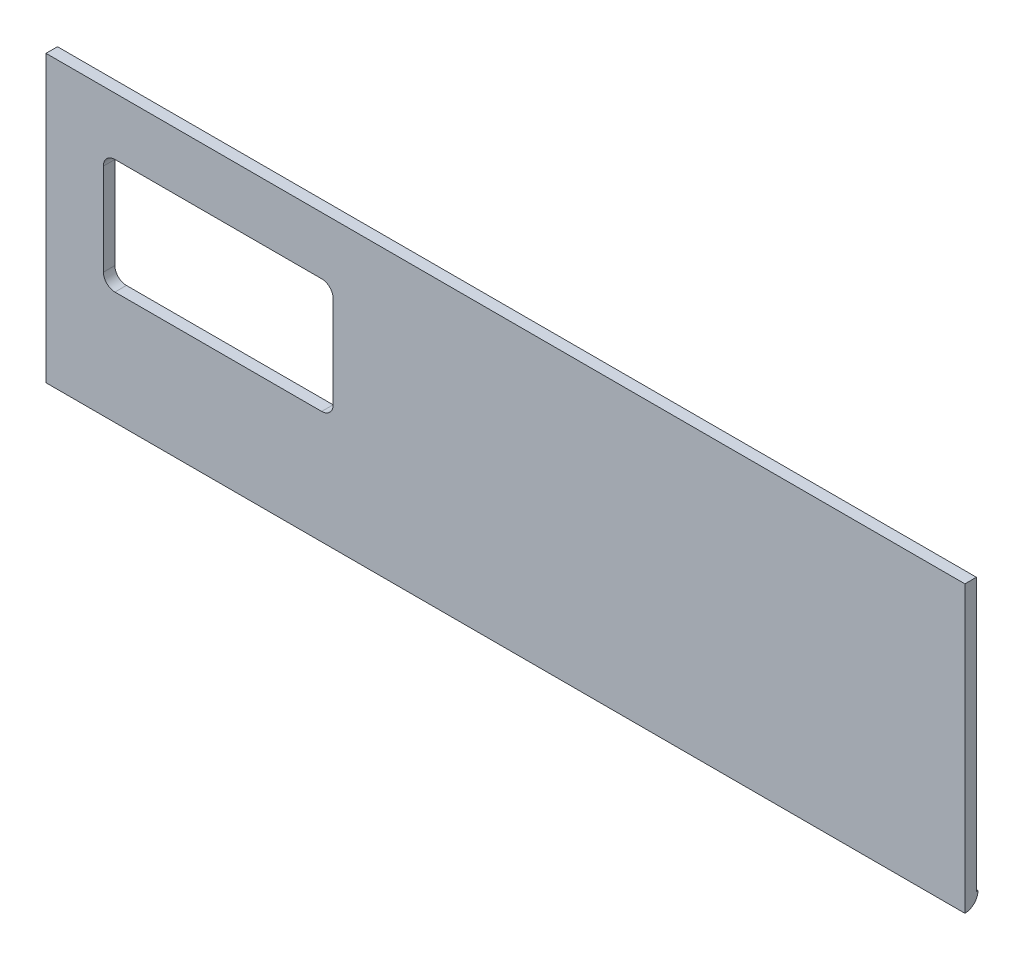
ISO-10303-21;
HEADER;
FILE_DESCRIPTION(('STEP AP214'),'2;1');
FILE_NAME('part.step','',(''),(''),'','','');
FILE_SCHEMA(('AUTOMOTIVE_DESIGN { 1 0 10303 214 1 1 1 1 }'));
ENDSEC;
DATA;
#1=APPLICATION_CONTEXT('core data for automotive mechanical design processes');
#2=APPLICATION_PROTOCOL_DEFINITION('international standard','automotive_design',2000,#1);
#3=PRODUCT_CONTEXT('',#1,'mechanical');
#4=PRODUCT('Part','Part','',(#3));
#5=PRODUCT_RELATED_PRODUCT_CATEGORY('part','',(#4));
#6=PRODUCT_DEFINITION_FORMATION('','',#4);
#7=PRODUCT_DEFINITION_CONTEXT('part definition',#1,'design');
#8=PRODUCT_DEFINITION('design','',#6,#7);
#9=PRODUCT_DEFINITION_SHAPE('','',#8);
#10=(LENGTH_UNIT() NAMED_UNIT(*) SI_UNIT(.MILLI.,.METRE.));
#11=(NAMED_UNIT(*) PLANE_ANGLE_UNIT() SI_UNIT($,.RADIAN.));
#12=(NAMED_UNIT(*) SI_UNIT($,.STERADIAN.) SOLID_ANGLE_UNIT());
#13=UNCERTAINTY_MEASURE_WITH_UNIT(LENGTH_MEASURE(1.E-05),#10,'distance_accuracy_value','');
#14=(GEOMETRIC_REPRESENTATION_CONTEXT(3) GLOBAL_UNCERTAINTY_ASSIGNED_CONTEXT((#13)) GLOBAL_UNIT_ASSIGNED_CONTEXT((#10,
#11,#12)) REPRESENTATION_CONTEXT('',''));
#15=CARTESIAN_POINT('',(0.,0.,0.));
#16=DIRECTION('',(0.,0.,1.));
#17=DIRECTION('',(1.,0.,0.));
#18=AXIS2_PLACEMENT_3D('',#15,#16,#17);
#19=CARTESIAN_POINT('',(0.,0.,0.));
#20=DIRECTION('',(0.,0.,1.));
#21=DIRECTION('',(1.,0.,0.));
#22=AXIS2_PLACEMENT_3D('',#19,#20,#21);
#23=PLANE('',#22);
#24=CARTESIAN_POINT('',(-16.,-1.64999999999999,0.));
#25=DIRECTION('',(0.,0.,-1.));
#26=DIRECTION('',(1.,0.,0.));
#27=AXIS2_PLACEMENT_3D('',#24,#25,#26);
#28=CIRCLE('',#27,1.);
#29=CARTESIAN_POINT('',(-15.,-1.64999999999999,0.));
#30=VERTEX_POINT('',#29);
#31=CARTESIAN_POINT('',(-16.,-2.64999999999999,0.));
#32=VERTEX_POINT('',#31);
#33=EDGE_CURVE('E183',#30,#32,#28,.T.);
#34=ORIENTED_EDGE('',*,*,#33,.F.);
#35=DIRECTION('',(0.,-1.,0.));
#36=VECTOR('',#35,1.);
#37=CARTESIAN_POINT('',(-15.,6.35,0.));
#38=LINE('',#37,#36);
#39=CARTESIAN_POINT('',(-15.,6.35,0.));
#40=VERTEX_POINT('',#39);
#41=EDGE_CURVE('E186',#40,#30,#38,.T.);
#42=ORIENTED_EDGE('',*,*,#41,.F.);
#43=CARTESIAN_POINT('',(-16.,6.35000000000001,0.));
#44=DIRECTION('',(0.,0.,-1.));
#45=DIRECTION('',(-1.,0.,0.));
#46=AXIS2_PLACEMENT_3D('',#43,#44,#45);
#47=CIRCLE('',#46,1.);
#48=CARTESIAN_POINT('',(-16.,7.35000000000001,0.));
#49=VERTEX_POINT('',#48);
#50=EDGE_CURVE('E189',#49,#40,#47,.T.);
#51=ORIENTED_EDGE('',*,*,#50,.F.);
#52=DIRECTION('',(1.,0.,0.));
#53=VECTOR('',#52,1.);
#54=CARTESIAN_POINT('',(-34.,7.35000000000001,0.));
#55=LINE('',#54,#53);
#56=CARTESIAN_POINT('',(-34.,7.35000000000001,0.));
#57=VERTEX_POINT('',#56);
#58=EDGE_CURVE('E55',#57,#49,#55,.T.);
#59=ORIENTED_EDGE('',*,*,#58,.F.);
#60=CARTESIAN_POINT('',(-34.,6.35000000000001,0.));
#61=DIRECTION('',(0.,0.,-1.));
#62=DIRECTION('',(1.,0.,0.));
#63=AXIS2_PLACEMENT_3D('',#60,#61,#62);
#64=CIRCLE('',#63,1.);
#65=CARTESIAN_POINT('',(-35.,6.35,0.));
#66=VERTEX_POINT('',#65);
#67=EDGE_CURVE('E171',#66,#57,#64,.T.);
#68=ORIENTED_EDGE('',*,*,#67,.F.);
#69=DIRECTION('',(0.,1.,0.));
#70=VECTOR('',#69,1.);
#71=CARTESIAN_POINT('',(-35.,6.35,0.));
#72=LINE('',#71,#70);
#73=CARTESIAN_POINT('',(-35.,-1.64999999999998,0.));
#74=VERTEX_POINT('',#73);
#75=EDGE_CURVE('E174',#74,#66,#72,.T.);
#76=ORIENTED_EDGE('',*,*,#75,.F.);
#77=CARTESIAN_POINT('',(-34.,-1.64999999999999,0.));
#78=DIRECTION('',(0.,0.,-1.));
#79=DIRECTION('',(1.,0.,0.));
#80=AXIS2_PLACEMENT_3D('',#77,#78,#79);
#81=CIRCLE('',#80,1.);
#82=CARTESIAN_POINT('',(-34.,-2.64999999999999,0.));
#83=VERTEX_POINT('',#82);
#84=EDGE_CURVE('E177',#83,#74,#81,.T.);
#85=ORIENTED_EDGE('',*,*,#84,.F.);
#86=DIRECTION('',(-1.,0.,0.));
#87=VECTOR('',#86,1.);
#88=CARTESIAN_POINT('',(-34.,-2.64999999999999,0.));
#89=LINE('',#88,#87);
#90=EDGE_CURVE('E180',#32,#83,#89,.T.);
#91=ORIENTED_EDGE('',*,*,#90,.F.);
#92=EDGE_LOOP('',(#34,#42,#51,#59,#68,#76,#85,#91));
#93=FACE_BOUND('',#92,.T.);
#94=DIRECTION('',(-1.,0.,0.));
#95=VECTOR('',#94,1.);
#96=CARTESIAN_POINT('',(60.,-11.35,0.));
#97=LINE('',#96,#95);
#98=CARTESIAN_POINT('',(-40.,-11.35,0.));
#99=VERTEX_POINT('',#98);
#100=CARTESIAN_POINT('',(40.,-11.35,0.));
#101=VERTEX_POINT('',#100);
#102=EDGE_CURVE('E11',#99,#101,#97,.F.);
#103=ORIENTED_EDGE('',*,*,#102,.F.);
#104=DIRECTION('',(0.,-1.,0.));
#105=VECTOR('',#104,1.);
#106=CARTESIAN_POINT('',(-40.,12.35,0.));
#107=LINE('',#106,#105);
#108=CARTESIAN_POINT('',(-40.,12.35,0.));
#109=VERTEX_POINT('',#108);
#110=EDGE_CURVE('E229',#109,#99,#107,.T.);
#111=ORIENTED_EDGE('',*,*,#110,.F.);
#112=DIRECTION('',(-1.,0.,0.));
#113=VECTOR('',#112,1.);
#114=CARTESIAN_POINT('',(-40.,12.35,0.));
#115=LINE('',#114,#113);
#116=CARTESIAN_POINT('',(40.,12.35,0.));
#117=VERTEX_POINT('',#116);
#118=EDGE_CURVE('E230',#117,#109,#115,.T.);
#119=ORIENTED_EDGE('',*,*,#118,.F.);
#120=DIRECTION('',(0.,1.,0.));
#121=VECTOR('',#120,1.);
#122=CARTESIAN_POINT('',(40.,12.35,0.));
#123=LINE('',#122,#121);
#124=EDGE_CURVE('E235',#101,#117,#123,.T.);
#125=ORIENTED_EDGE('',*,*,#124,.F.);
#126=EDGE_LOOP('',(#103,#111,#119,#125));
#127=FACE_BOUND('',#126,.T.);
#128=ADVANCED_FACE('F40',(#93,#127),#23,.F.);
#129=CARTESIAN_POINT('',(-40.,12.35,1.));
#130=DIRECTION('',(1.,0.,0.));
#131=DIRECTION('',(0.,0.,-1.));
#132=AXIS2_PLACEMENT_3D('',#129,#130,#131);
#133=PLANE('',#132);
#134=ORIENTED_EDGE('',*,*,#110,.T.);
#135=DIRECTION('',(0.,0.,-1.));
#136=VECTOR('',#135,1.);
#137=CARTESIAN_POINT('',(-40.,-11.35,0.));
#138=LINE('',#137,#136);
#139=CARTESIAN_POINT('',(-40.,-11.35,-0.14));
#140=VERTEX_POINT('',#139);
#141=EDGE_CURVE('E164',#99,#140,#138,.T.);
#142=ORIENTED_EDGE('',*,*,#141,.T.);
#143=CARTESIAN_POINT('',(-40.,-11.35,1.));
#144=DIRECTION('',(1.,0.,0.));
#145=DIRECTION('',(0.,0.,-1.));
#146=AXIS2_PLACEMENT_3D('',#143,#144,#145);
#147=CIRCLE('',#146,1.14);
#148=CARTESIAN_POINT('',(-40.,-12.49,1.));
#149=VERTEX_POINT('',#148);
#150=EDGE_CURVE('E167',#140,#149,#147,.F.);
#151=ORIENTED_EDGE('',*,*,#150,.T.);
#152=DIRECTION('',(0.,-1.,0.));
#153=VECTOR('',#152,1.);
#154=CARTESIAN_POINT('',(-40.,12.35,1.));
#155=LINE('',#154,#153);
#156=CARTESIAN_POINT('',(-40.,12.35,1.));
#157=VERTEX_POINT('',#156);
#158=EDGE_CURVE('E147',#157,#149,#155,.T.);
#159=ORIENTED_EDGE('',*,*,#158,.F.);
#160=DIRECTION('',(0.,0.,-1.));
#161=VECTOR('',#160,1.);
#162=CARTESIAN_POINT('',(-40.,12.35,1.));
#163=LINE('',#162,#161);
#164=EDGE_CURVE('E233',#157,#109,#163,.T.);
#165=ORIENTED_EDGE('',*,*,#164,.T.);
#166=EDGE_LOOP('',(#134,#142,#151,#159,#165));
#167=FACE_BOUND('',#166,.T.);
#168=ADVANCED_FACE('F42',(#167),#133,.F.);
#169=CARTESIAN_POINT('',(40.,12.35,1.));
#170=DIRECTION('',(-1.,0.,0.));
#171=DIRECTION('',(0.,0.,1.));
#172=AXIS2_PLACEMENT_3D('',#169,#170,#171);
#173=PLANE('',#172);
#174=DIRECTION('',(0.,1.,0.));
#175=VECTOR('',#174,1.);
#176=CARTESIAN_POINT('',(40.,12.35,1.));
#177=LINE('',#176,#175);
#178=CARTESIAN_POINT('',(40.,-12.49,1.));
#179=VERTEX_POINT('',#178);
#180=CARTESIAN_POINT('',(40.,12.35,1.));
#181=VERTEX_POINT('',#180);
#182=EDGE_CURVE('E136',#179,#181,#177,.T.);
#183=ORIENTED_EDGE('',*,*,#182,.F.);
#184=CARTESIAN_POINT('',(40.,-11.35,1.));
#185=DIRECTION('',(1.,0.,0.));
#186=DIRECTION('',(0.,0.,-1.));
#187=AXIS2_PLACEMENT_3D('',#184,#185,#186);
#188=CIRCLE('',#187,1.14);
#189=CARTESIAN_POINT('',(40.,-11.35,-0.14));
#190=VERTEX_POINT('',#189);
#191=EDGE_CURVE('E141',#179,#190,#188,.T.);
#192=ORIENTED_EDGE('',*,*,#191,.T.);
#193=DIRECTION('',(0.,0.,1.));
#194=VECTOR('',#193,1.);
#195=CARTESIAN_POINT('',(40.,-11.35,0.));
#196=LINE('',#195,#194);
#197=EDGE_CURVE('E157',#190,#101,#196,.T.);
#198=ORIENTED_EDGE('',*,*,#197,.T.);
#199=ORIENTED_EDGE('',*,*,#124,.T.);
#200=DIRECTION('',(0.,0.,-1.));
#201=VECTOR('',#200,1.);
#202=CARTESIAN_POINT('',(40.,12.35,1.));
#203=LINE('',#202,#201);
#204=EDGE_CURVE('E48',#181,#117,#203,.T.);
#205=ORIENTED_EDGE('',*,*,#204,.F.);
#206=EDGE_LOOP('',(#183,#192,#198,#199,#205));
#207=FACE_BOUND('',#206,.T.);
#208=ADVANCED_FACE('F138',(#207),#173,.F.);
#209=CARTESIAN_POINT('',(-40.,12.35,1.));
#210=DIRECTION('',(0.,-1.,0.));
#211=DIRECTION('',(1.,0.,0.));
#212=AXIS2_PLACEMENT_3D('',#209,#210,#211);
#213=PLANE('',#212);
#214=ORIENTED_EDGE('',*,*,#118,.T.);
#215=ORIENTED_EDGE('',*,*,#164,.F.);
#216=DIRECTION('',(-1.,0.,0.));
#217=VECTOR('',#216,1.);
#218=CARTESIAN_POINT('',(-40.,12.35,1.));
#219=LINE('',#218,#217);
#220=EDGE_CURVE('E146',#181,#157,#219,.T.);
#221=ORIENTED_EDGE('',*,*,#220,.F.);
#222=ORIENTED_EDGE('',*,*,#204,.T.);
#223=EDGE_LOOP('',(#214,#215,#221,#222));
#224=FACE_BOUND('',#223,.T.);
#225=ADVANCED_FACE('F241',(#224),#213,.F.);
#226=CARTESIAN_POINT('',(0.,0.,1.));
#227=DIRECTION('',(0.,0.,1.));
#228=DIRECTION('',(1.,0.,0.));
#229=AXIS2_PLACEMENT_3D('',#226,#227,#228);
#230=PLANE('',#229);
#231=DIRECTION('',(0.,-1.,0.));
#232=VECTOR('',#231,1.);
#233=CARTESIAN_POINT('',(-15.,6.35,1.));
#234=LINE('',#233,#232);
#235=CARTESIAN_POINT('',(-15.,6.35000000000001,1.));
#236=VERTEX_POINT('',#235);
#237=CARTESIAN_POINT('',(-15.,-1.64999999999999,1.00000000000001));
#238=VERTEX_POINT('',#237);
#239=EDGE_CURVE('E170',#236,#238,#234,.T.);
#240=ORIENTED_EDGE('',*,*,#239,.T.);
#241=CARTESIAN_POINT('',(-16.,-1.64999999999999,1.));
#242=DIRECTION('',(0.,0.,1.));
#243=DIRECTION('',(1.,0.,0.));
#244=AXIS2_PLACEMENT_3D('',#241,#242,#243);
#245=CIRCLE('',#244,1.);
#246=CARTESIAN_POINT('',(-16.,-2.64999999999999,1.));
#247=VERTEX_POINT('',#246);
#248=EDGE_CURVE('E218',#238,#247,#245,.F.);
#249=ORIENTED_EDGE('',*,*,#248,.T.);
#250=DIRECTION('',(-1.,0.,0.));
#251=VECTOR('',#250,1.);
#252=CARTESIAN_POINT('',(-34.,-2.64999999999999,1.));
#253=LINE('',#252,#251);
#254=CARTESIAN_POINT('',(-34.,-2.64999999999999,1.));
#255=VERTEX_POINT('',#254);
#256=EDGE_CURVE('E214',#247,#255,#253,.T.);
#257=ORIENTED_EDGE('',*,*,#256,.T.);
#258=CARTESIAN_POINT('',(-34.,-1.64999999999999,1.));
#259=DIRECTION('',(0.,0.,1.));
#260=DIRECTION('',(1.,0.,0.));
#261=AXIS2_PLACEMENT_3D('',#258,#259,#260);
#262=CIRCLE('',#261,1.);
#263=CARTESIAN_POINT('',(-35.,-1.64999999999998,1.));
#264=VERTEX_POINT('',#263);
#265=EDGE_CURVE('E210',#255,#264,#262,.F.);
#266=ORIENTED_EDGE('',*,*,#265,.T.);
#267=DIRECTION('',(0.,1.,0.));
#268=VECTOR('',#267,1.);
#269=CARTESIAN_POINT('',(-35.,6.35,1.));
#270=LINE('',#269,#268);
#271=CARTESIAN_POINT('',(-35.,6.35,1.));
#272=VERTEX_POINT('',#271);
#273=EDGE_CURVE('E206',#264,#272,#270,.T.);
#274=ORIENTED_EDGE('',*,*,#273,.T.);
#275=CARTESIAN_POINT('',(-34.,6.35000000000001,1.));
#276=DIRECTION('',(0.,0.,1.));
#277=DIRECTION('',(1.,0.,0.));
#278=AXIS2_PLACEMENT_3D('',#275,#276,#277);
#279=CIRCLE('',#278,1.);
#280=CARTESIAN_POINT('',(-34.,7.35000000000001,1.));
#281=VERTEX_POINT('',#280);
#282=EDGE_CURVE('E202',#272,#281,#279,.F.);
#283=ORIENTED_EDGE('',*,*,#282,.T.);
#284=DIRECTION('',(1.,0.,0.));
#285=VECTOR('',#284,1.);
#286=CARTESIAN_POINT('',(-34.,7.35000000000001,1.));
#287=LINE('',#286,#285);
#288=CARTESIAN_POINT('',(-16.,7.35000000000001,1.));
#289=VERTEX_POINT('',#288);
#290=EDGE_CURVE('E198',#281,#289,#287,.T.);
#291=ORIENTED_EDGE('',*,*,#290,.T.);
#292=CARTESIAN_POINT('',(-16.,6.35000000000001,1.));
#293=DIRECTION('',(0.,0.,1.));
#294=DIRECTION('',(1.,0.,0.));
#295=AXIS2_PLACEMENT_3D('',#292,#293,#294);
#296=CIRCLE('',#295,1.);
#297=EDGE_CURVE('E194',#289,#236,#296,.F.);
#298=ORIENTED_EDGE('',*,*,#297,.T.);
#299=EDGE_LOOP('',(#240,#249,#257,#266,#274,#283,#291,#298));
#300=FACE_BOUND('',#299,.T.);
#301=ORIENTED_EDGE('',*,*,#158,.T.);
#302=DIRECTION('',(1.,0.,0.));
#303=VECTOR('',#302,1.);
#304=CARTESIAN_POINT('',(-41.6122034611053,-12.49,1.));
#305=LINE('',#304,#303);
#306=EDGE_CURVE('E150',#149,#179,#305,.T.);
#307=ORIENTED_EDGE('',*,*,#306,.T.);
#308=ORIENTED_EDGE('',*,*,#182,.T.);
#309=ORIENTED_EDGE('',*,*,#220,.T.);
#310=EDGE_LOOP('',(#301,#307,#308,#309));
#311=FACE_BOUND('',#310,.T.);
#312=ADVANCED_FACE('F151',(#300,#311),#230,.T.);
#313=CARTESIAN_POINT('',(-15.,6.35,23.3606797749979));
#314=DIRECTION('',(1.,0.,0.));
#315=DIRECTION('',(0.,0.,-1.));
#316=AXIS2_PLACEMENT_3D('',#313,#314,#315);
#317=PLANE('',#316);
#318=DIRECTION('',(0.,0.,-1.));
#319=VECTOR('',#318,1.);
#320=CARTESIAN_POINT('',(-15.,6.35,23.3606797749979));
#321=LINE('',#320,#319);
#322=EDGE_CURVE('E63',#236,#40,#321,.T.);
#323=ORIENTED_EDGE('',*,*,#322,.T.);
#324=ORIENTED_EDGE('',*,*,#41,.T.);
#325=DIRECTION('',(0.,0.,-1.));
#326=VECTOR('',#325,1.);
#327=CARTESIAN_POINT('',(-15.,-1.64999999999999,23.3606797749979));
#328=LINE('',#327,#326);
#329=EDGE_CURVE('E193',#238,#30,#328,.T.);
#330=ORIENTED_EDGE('',*,*,#329,.F.);
#331=ORIENTED_EDGE('',*,*,#239,.F.);
#332=EDGE_LOOP('',(#323,#324,#330,#331));
#333=FACE_BOUND('',#332,.T.);
#334=ADVANCED_FACE('F287',(#333),#317,.F.);
#335=CARTESIAN_POINT('',(-16.,-1.64999999999999,23.3606797749979));
#336=DIRECTION('',(0.,0.,-1.));
#337=DIRECTION('',(-1.,0.,0.));
#338=AXIS2_PLACEMENT_3D('',#335,#336,#337);
#339=CYLINDRICAL_SURFACE('',#338,1.);
#340=ORIENTED_EDGE('',*,*,#329,.T.);
#341=ORIENTED_EDGE('',*,*,#33,.T.);
#342=DIRECTION('',(0.,0.,-1.));
#343=VECTOR('',#342,1.);
#344=CARTESIAN_POINT('',(-16.,-2.64999999999999,23.3606797749979));
#345=LINE('',#344,#343);
#346=EDGE_CURVE('E217',#247,#32,#345,.T.);
#347=ORIENTED_EDGE('',*,*,#346,.F.);
#348=ORIENTED_EDGE('',*,*,#248,.F.);
#349=EDGE_LOOP('',(#340,#341,#347,#348));
#350=FACE_BOUND('',#349,.T.);
#351=ADVANCED_FACE('F293',(#350),#339,.F.);
#352=CARTESIAN_POINT('',(-34.,-2.64999999999999,23.3606797749979));
#353=DIRECTION('',(0.,-1.,0.));
#354=DIRECTION('',(1.,0.,0.));
#355=AXIS2_PLACEMENT_3D('',#352,#353,#354);
#356=PLANE('',#355);
#357=ORIENTED_EDGE('',*,*,#346,.T.);
#358=ORIENTED_EDGE('',*,*,#90,.T.);
#359=DIRECTION('',(0.,0.,-1.));
#360=VECTOR('',#359,1.);
#361=CARTESIAN_POINT('',(-34.,-2.64999999999999,23.3606797749979));
#362=LINE('',#361,#360);
#363=EDGE_CURVE('E213',#255,#83,#362,.T.);
#364=ORIENTED_EDGE('',*,*,#363,.F.);
#365=ORIENTED_EDGE('',*,*,#256,.F.);
#366=EDGE_LOOP('',(#357,#358,#364,#365));
#367=FACE_BOUND('',#366,.T.);
#368=ADVANCED_FACE('F300',(#367),#356,.F.);
#369=CARTESIAN_POINT('',(-34.,-1.64999999999999,23.3606797749979));
#370=DIRECTION('',(0.,0.,-1.));
#371=DIRECTION('',(-1.,0.,0.));
#372=AXIS2_PLACEMENT_3D('',#369,#370,#371);
#373=CYLINDRICAL_SURFACE('',#372,1.);
#374=ORIENTED_EDGE('',*,*,#363,.T.);
#375=ORIENTED_EDGE('',*,*,#84,.T.);
#376=DIRECTION('',(0.,0.,-1.));
#377=VECTOR('',#376,1.);
#378=CARTESIAN_POINT('',(-35.,-1.64999999999998,23.3606797749979));
#379=LINE('',#378,#377);
#380=EDGE_CURVE('E209',#264,#74,#379,.T.);
#381=ORIENTED_EDGE('',*,*,#380,.F.);
#382=ORIENTED_EDGE('',*,*,#265,.F.);
#383=EDGE_LOOP('',(#374,#375,#381,#382));
#384=FACE_BOUND('',#383,.T.);
#385=ADVANCED_FACE('F308',(#384),#373,.F.);
#386=CARTESIAN_POINT('',(-35.,6.35,23.3606797749979));
#387=DIRECTION('',(-1.,0.,0.));
#388=DIRECTION('',(0.,0.,1.));
#389=AXIS2_PLACEMENT_3D('',#386,#387,#388);
#390=PLANE('',#389);
#391=ORIENTED_EDGE('',*,*,#380,.T.);
#392=ORIENTED_EDGE('',*,*,#75,.T.);
#393=DIRECTION('',(0.,0.,-1.));
#394=VECTOR('',#393,1.);
#395=CARTESIAN_POINT('',(-35.,6.35,23.3606797749979));
#396=LINE('',#395,#394);
#397=EDGE_CURVE('E205',#272,#66,#396,.T.);
#398=ORIENTED_EDGE('',*,*,#397,.F.);
#399=ORIENTED_EDGE('',*,*,#273,.F.);
#400=EDGE_LOOP('',(#391,#392,#398,#399));
#401=FACE_BOUND('',#400,.T.);
#402=ADVANCED_FACE('F316',(#401),#390,.F.);
#403=CARTESIAN_POINT('',(-34.,6.35000000000001,23.3606797749979));
#404=DIRECTION('',(0.,0.,-1.));
#405=DIRECTION('',(-1.,0.,0.));
#406=AXIS2_PLACEMENT_3D('',#403,#404,#405);
#407=CYLINDRICAL_SURFACE('',#406,1.);
#408=ORIENTED_EDGE('',*,*,#397,.T.);
#409=ORIENTED_EDGE('',*,*,#67,.T.);
#410=DIRECTION('',(0.,0.,-1.));
#411=VECTOR('',#410,1.);
#412=CARTESIAN_POINT('',(-34.,7.35000000000001,23.3606797749979));
#413=LINE('',#412,#411);
#414=EDGE_CURVE('E201',#281,#57,#413,.T.);
#415=ORIENTED_EDGE('',*,*,#414,.F.);
#416=ORIENTED_EDGE('',*,*,#282,.F.);
#417=EDGE_LOOP('',(#408,#409,#415,#416));
#418=FACE_BOUND('',#417,.T.);
#419=ADVANCED_FACE('F324',(#418),#407,.F.);
#420=CARTESIAN_POINT('',(-34.,7.35000000000001,23.3606797749979));
#421=DIRECTION('',(0.,1.,0.));
#422=DIRECTION('',(-1.,0.,0.));
#423=AXIS2_PLACEMENT_3D('',#420,#421,#422);
#424=PLANE('',#423);
#425=ORIENTED_EDGE('',*,*,#414,.T.);
#426=ORIENTED_EDGE('',*,*,#58,.T.);
#427=DIRECTION('',(0.,0.,-1.));
#428=VECTOR('',#427,1.);
#429=CARTESIAN_POINT('',(-16.,7.35000000000001,23.3606797749979));
#430=LINE('',#429,#428);
#431=EDGE_CURVE('E197',#289,#49,#430,.T.);
#432=ORIENTED_EDGE('',*,*,#431,.F.);
#433=ORIENTED_EDGE('',*,*,#290,.F.);
#434=EDGE_LOOP('',(#425,#426,#432,#433));
#435=FACE_BOUND('',#434,.T.);
#436=ADVANCED_FACE('F258',(#435),#424,.F.);
#437=CARTESIAN_POINT('',(-16.,6.35000000000001,23.3606797749979));
#438=DIRECTION('',(0.,0.,-1.));
#439=DIRECTION('',(-1.,0.,0.));
#440=AXIS2_PLACEMENT_3D('',#437,#438,#439);
#441=CYLINDRICAL_SURFACE('',#440,1.);
#442=ORIENTED_EDGE('',*,*,#431,.T.);
#443=ORIENTED_EDGE('',*,*,#50,.T.);
#444=ORIENTED_EDGE('',*,*,#322,.F.);
#445=ORIENTED_EDGE('',*,*,#297,.F.);
#446=EDGE_LOOP('',(#442,#443,#444,#445));
#447=FACE_BOUND('',#446,.T.);
#448=ADVANCED_FACE('F251',(#447),#441,.F.);
#449=CARTESIAN_POINT('',(-41.6122034611053,-11.35,0.));
#450=DIRECTION('',(0.,1.,0.));
#451=DIRECTION('',(0.,0.,1.));
#452=AXIS2_PLACEMENT_3D('',#449,#450,#451);
#453=PLANE('',#452);
#454=ORIENTED_EDGE('',*,*,#141,.F.);
#455=ORIENTED_EDGE('',*,*,#102,.T.);
#456=ORIENTED_EDGE('',*,*,#197,.F.);
#457=DIRECTION('',(1.,0.,0.));
#458=VECTOR('',#457,1.);
#459=CARTESIAN_POINT('',(-41.6122034611053,-11.35,-0.14));
#460=LINE('',#459,#458);
#461=EDGE_CURVE('E156',#140,#190,#460,.T.);
#462=ORIENTED_EDGE('',*,*,#461,.F.);
#463=EDGE_LOOP('',(#454,#455,#456,#462));
#464=FACE_BOUND('',#463,.T.);
#465=ADVANCED_FACE('F249',(#464),#453,.T.);
#466=CARTESIAN_POINT('',(-41.6122034611053,-11.35,1.));
#467=DIRECTION('',(1.,0.,0.));
#468=DIRECTION('',(0.,0.,-1.));
#469=AXIS2_PLACEMENT_3D('',#466,#467,#468);
#470=CYLINDRICAL_SURFACE('',#469,1.14);
#471=ORIENTED_EDGE('',*,*,#150,.F.);
#472=ORIENTED_EDGE('',*,*,#461,.T.);
#473=ORIENTED_EDGE('',*,*,#191,.F.);
#474=ORIENTED_EDGE('',*,*,#306,.F.);
#475=EDGE_LOOP('',(#471,#472,#473,#474));
#476=FACE_BOUND('',#475,.T.);
#477=ADVANCED_FACE('F159',(#476),#470,.T.);
#478=CLOSED_SHELL('',(#128,#168,#208,#225,#312,#334,#351,#368,#385,#402,#419,#436,#448,#465,#477));
#479=MANIFOLD_SOLID_BREP('B2',#478);
#480=ADVANCED_BREP_SHAPE_REPRESENTATION('',(#18,#479),#14);
#481=SHAPE_DEFINITION_REPRESENTATION(#9,#480);
ENDSEC;
END-ISO-10303-21;
